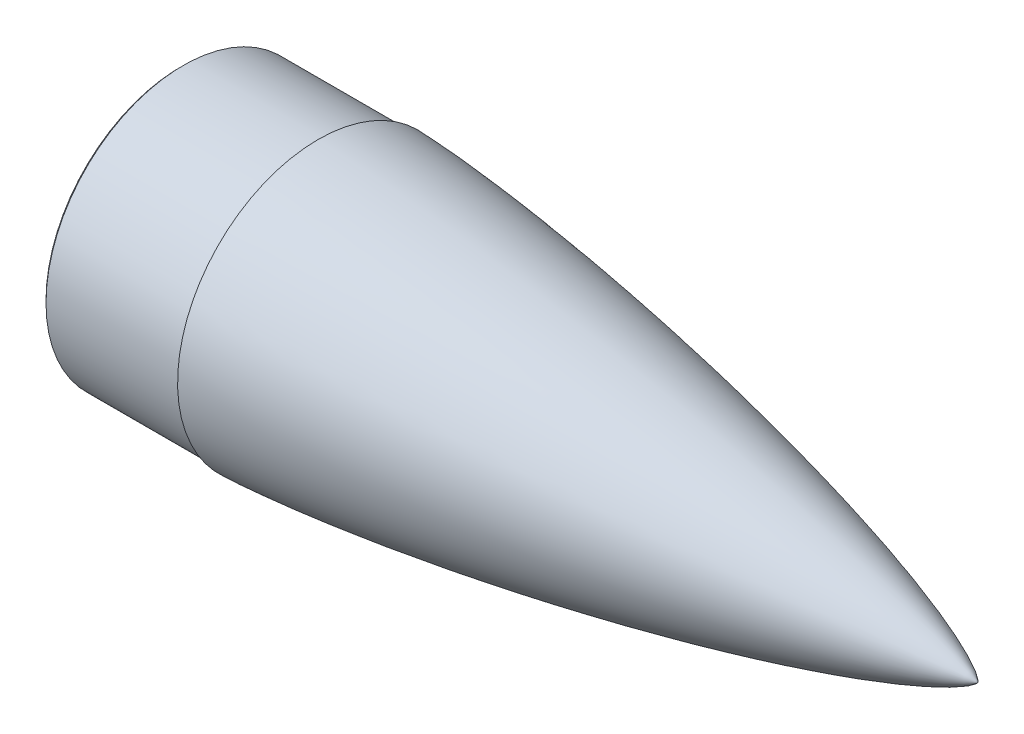
ISO-10303-21;
HEADER;
FILE_DESCRIPTION(('STEP AP214'),'2;1');
FILE_NAME('part.step','',(''),(''),'','','');
FILE_SCHEMA(('AUTOMOTIVE_DESIGN { 1 0 10303 214 1 1 1 1 }'));
ENDSEC;
DATA;
#1=APPLICATION_CONTEXT('core data for automotive mechanical design processes');
#2=APPLICATION_PROTOCOL_DEFINITION('international standard','automotive_design',2000,#1);
#3=PRODUCT_CONTEXT('',#1,'mechanical');
#4=PRODUCT('Part','Part','',(#3));
#5=PRODUCT_RELATED_PRODUCT_CATEGORY('part','',(#4));
#6=PRODUCT_DEFINITION_FORMATION('','',#4);
#7=PRODUCT_DEFINITION_CONTEXT('part definition',#1,'design');
#8=PRODUCT_DEFINITION('design','',#6,#7);
#9=PRODUCT_DEFINITION_SHAPE('','',#8);
#10=(LENGTH_UNIT() NAMED_UNIT(*) SI_UNIT(.MILLI.,.METRE.));
#11=(NAMED_UNIT(*) PLANE_ANGLE_UNIT() SI_UNIT($,.RADIAN.));
#12=(NAMED_UNIT(*) SI_UNIT($,.STERADIAN.) SOLID_ANGLE_UNIT());
#13=UNCERTAINTY_MEASURE_WITH_UNIT(LENGTH_MEASURE(1.E-05),#10,'distance_accuracy_value','');
#14=(GEOMETRIC_REPRESENTATION_CONTEXT(3) GLOBAL_UNCERTAINTY_ASSIGNED_CONTEXT((#13)) GLOBAL_UNIT_ASSIGNED_CONTEXT((#10,
#11,#12)) REPRESENTATION_CONTEXT('',''));
#15=CARTESIAN_POINT('',(0.,0.,0.));
#16=DIRECTION('',(0.,0.,1.));
#17=DIRECTION('',(1.,0.,0.));
#18=AXIS2_PLACEMENT_3D('',#15,#16,#17);
#19=CARTESIAN_POINT('',(-84.6045174731784,81.99983,0.));
#20=DIRECTION('',(-1.,0.,0.));
#21=DIRECTION('',(0.,0.,1.));
#22=AXIS2_PLACEMENT_3D('',#19,#20,#21);
#23=PLANE('',#22);
#24=CARTESIAN_POINT('',(-84.6045174731784,0.,0.));
#25=DIRECTION('',(-1.,0.,0.));
#26=DIRECTION('',(0.,0.,1.));
#27=AXIS2_PLACEMENT_3D('',#24,#25,#26);
#28=CIRCLE('',#27,83.49983);
#29=CARTESIAN_POINT('',(-84.6045174731784,0.,83.49983));
#30=VERTEX_POINT('',#29);
#31=EDGE_CURVE('E11',#30,#30,#28,.T.);
#32=ORIENTED_EDGE('',*,*,#31,.T.);
#33=EDGE_LOOP('',(#32));
#34=FACE_BOUND('',#33,.T.);
#35=CARTESIAN_POINT('',(-84.6045174731784,0.,0.));
#36=DIRECTION('',(1.,0.,0.));
#37=DIRECTION('',(0.,0.,-1.));
#38=AXIS2_PLACEMENT_3D('',#35,#36,#37);
#39=CIRCLE('',#38,81.99983);
#40=CARTESIAN_POINT('',(-84.6045174731784,0.,-81.99983));
#41=VERTEX_POINT('',#40);
#42=EDGE_CURVE('E115',#41,#41,#39,.T.);
#43=ORIENTED_EDGE('',*,*,#42,.T.);
#44=EDGE_LOOP('',(#43));
#45=FACE_BOUND('',#44,.T.);
#46=ADVANCED_FACE('F37',(#34,#45),#23,.T.);
#47=CARTESIAN_POINT('',(46.9178584693199,0.,0.));
#48=DIRECTION('',(1.,0.,0.));
#49=DIRECTION('',(0.,0.,-1.));
#50=AXIS2_PLACEMENT_3D('',#47,#48,#49);
#51=CYLINDRICAL_SURFACE('',#50,84.99983);
#52=CARTESIAN_POINT('',(-83.1045174731784,0.,0.));
#53=DIRECTION('',(-1.,0.,0.));
#54=DIRECTION('',(0.,0.,1.));
#55=AXIS2_PLACEMENT_3D('',#52,#53,#54);
#56=CIRCLE('',#55,84.99983);
#57=CARTESIAN_POINT('',(-83.1045174731784,0.,84.99983));
#58=VERTEX_POINT('',#57);
#59=EDGE_CURVE('E45',#58,#58,#56,.F.);
#60=ORIENTED_EDGE('',*,*,#59,.T.);
#61=EDGE_LOOP('',(#60));
#62=FACE_BOUND('',#61,.T.);
#63=CARTESIAN_POINT('',(0.395312526821567,0.,0.));
#64=DIRECTION('',(1.,0.,0.));
#65=DIRECTION('',(0.,0.,-1.));
#66=AXIS2_PLACEMENT_3D('',#63,#64,#65);
#67=CIRCLE('',#66,84.99983);
#68=CARTESIAN_POINT('',(0.395312526821567,0.,-84.99983));
#69=VERTEX_POINT('',#68);
#70=EDGE_CURVE('E167',#69,#69,#67,.T.);
#71=ORIENTED_EDGE('',*,*,#70,.F.);
#72=EDGE_LOOP('',(#71));
#73=FACE_BOUND('',#72,.T.);
#74=ADVANCED_FACE('F141',(#62,#73),#51,.T.);
#75=CARTESIAN_POINT('',(0.395312526821506,84.99983,0.));
#76=DIRECTION('',(-1.,0.,0.));
#77=DIRECTION('',(0.,0.,1.));
#78=AXIS2_PLACEMENT_3D('',#75,#76,#77);
#79=PLANE('',#78);
#80=ORIENTED_EDGE('',*,*,#70,.T.);
#81=EDGE_LOOP('',(#80));
#82=FACE_BOUND('',#81,.T.);
#83=CARTESIAN_POINT('',(0.395312526821442,0.,0.));
#84=DIRECTION('',(1.,0.,0.));
#85=DIRECTION('',(0.,0.,-1.));
#86=AXIS2_PLACEMENT_3D('',#83,#84,#85);
#87=CIRCLE('',#86,86.99983);
#88=CARTESIAN_POINT('',(0.395312526821442,0.,-86.99983));
#89=VERTEX_POINT('',#88);
#90=EDGE_CURVE('E164',#89,#89,#87,.T.);
#91=ORIENTED_EDGE('',*,*,#90,.F.);
#92=EDGE_LOOP('',(#91));
#93=FACE_BOUND('',#92,.T.);
#94=ADVANCED_FACE('F137',(#82,#93),#79,.T.);
#95=CARTESIAN_POINT('',(408.967251822671,0.,0.));
#96=CARTESIAN_POINT('',(408.964913524309,0.0135017388946303,0.));
#97=CARTESIAN_POINT('',(408.958040757842,0.0399160773368835,0.));
#98=CARTESIAN_POINT('',(408.936520440702,0.0904856976591331,0.));
#99=CARTESIAN_POINT('',(408.89222207581,0.174057132181965,0.));
#100=CARTESIAN_POINT('',(408.826281575483,0.275556802982871,0.));
#101=CARTESIAN_POINT('',(408.721696416073,0.415833756400021,0.));
#102=CARTESIAN_POINT('',(408.561101809182,0.605075244665577,0.));
#103=CARTESIAN_POINT('',(408.305619180198,0.872424149776899,0.));
#104=CARTESIAN_POINT('',(407.869667129884,1.27529956193635,0.));
#105=CARTESIAN_POINT('',(407.120955137874,1.88514211511049,0.));
#106=CARTESIAN_POINT('',(405.803773451327,2.8259018501857,0.));
#107=CARTESIAN_POINT('',(403.462406920435,4.28715279437305,0.));
#108=CARTESIAN_POINT('',(399.325294487522,6.53181845443187,0.));
#109=CARTESIAN_POINT('',(392.481146887534,9.75890464929676,0.));
#110=CARTESIAN_POINT('',(380.662076725118,14.628008466058,0.));
#111=CARTESIAN_POINT('',(363.637187185103,20.7117203818523,0.));
#112=CARTESIAN_POINT('',(342.215241093199,27.476512988503,0.));
#113=CARTESIAN_POINT('',(317.428462321169,34.4976264699902,0.));
#114=CARTESIAN_POINT('',(291.879335737445,41.1048243902447,0.));
#115=CARTESIAN_POINT('',(266.210460920412,47.2289931688774,0.));
#116=CARTESIAN_POINT('',(240.445488359744,52.9334367772789,0.));
#117=CARTESIAN_POINT('',(214.598861982297,58.2554390089734,0.));
#118=CARTESIAN_POINT('',(188.680895660279,63.2175826932426,0.));
#119=CARTESIAN_POINT('',(165.946174917208,67.2532806785126,0.));
#120=CARTESIAN_POINT('',(146.421982586261,70.4937997215436,0.));
#121=CARTESIAN_POINT('',(130.127893898103,73.0449474678022,0.));
#122=CARTESIAN_POINT('',(117.078590637244,74.994157933287,0.));
#123=CARTESIAN_POINT('',(104.015464216165,76.8485407904921,0.));
#124=CARTESIAN_POINT('',(92.5732639587286,78.3844920450082,0.));
#125=CARTESIAN_POINT('',(82.757139440995,79.6356039727628,0.));
#126=CARTESIAN_POINT('',(74.5713401839697,80.6322199022326,0.));
#127=CARTESIAN_POINT('',(68.0192604541921,81.4008042107162,0.));
#128=CARTESIAN_POINT('',(61.4637233644967,82.1393758993439,0.));
#129=CARTESIAN_POINT('',(54.904698020018,82.8463772595978,0.));
#130=CARTESIAN_POINT('',(48.3421599181037,83.5199405058238,0.));
#131=CARTESIAN_POINT('',(41.7760575593893,84.1577871701676,0.));
#132=CARTESIAN_POINT('',(36.0275410798151,84.6821572388814,0.));
#133=CARTESIAN_POINT('',(31.097921258978,85.1052349120102,0.));
#134=CARTESIAN_POINT('',(26.9883179227046,85.4386698248277,0.));
#135=CARTESIAN_POINT('',(23.6996666177478,85.6932185939728,0.));
#136=CARTESIAN_POINT('',(20.0858078220367,85.9584480380997,0.));
#137=CARTESIAN_POINT('',(16.7198738206758,86.1890184851633,0.));
#138=CARTESIAN_POINT('',(13.6020982871385,86.3869667789933,0.));
#139=CARTESIAN_POINT('',(10.7327040130569,86.5545757438157,0.));
#140=CARTESIAN_POINT('',(8.43663500836282,86.6787032911545,0.));
#141=CARTESIAN_POINT('',(6.13999734052088,86.7921575854767,0.));
#142=CARTESIAN_POINT('',(4.12989206270139,86.8793132637732,0.));
#143=CARTESIAN_POINT('',(2.40653858007264,86.9446189815575,0.));
#144=CARTESIAN_POINT('',(1.25734863548316,86.9790224955032,0.));
#145=CARTESIAN_POINT('',(0.682697909866076,86.9949146203242,0.));
#146=CARTESIAN_POINT('',(0.395312526821445,86.99983,0.));
#147=B_SPLINE_CURVE_WITH_KNOTS('',4,(#95,#96,#97,#98,#99,#100,#101,#102,#103,#104,#105,#106,
#107,#108,#109,#110,#111,#112,#113,#114,#115,#116,#117,#118,#119,#120,#121,#122,#123,#124,#125,
#126,#127,#128,#129,#130,#131,#132,#133,#134,#135,#136,#137,#138,#139,#140,#141,#142,#143,#144,
#145,#146),.UNSPECIFIED.,.F.,.F.,(5,1,1,1,1,1,1,1,1,1,1,1,1,1,1,1,1,1,1,1,1,1,1,1,1,1,1,1,1,1,1,
1,1,1,1,1,1,1,1,1,1,1,1,1,1,1,1,1,5),(0.,0.000130122730793774,0.000260245461587547,
0.000520490923175095,0.000900390598891898,0.0012802902746087,0.00192509879202123,
0.00288150817718921,0.00441820752915464,0.00692708577491599,0.0111106973974526,
0.0182791377136376,0.0306727604209067,0.051704468996729,0.0831022801208259,0.139908797407073,
0.202702512646724,0.26549616528218,0.328289681584927,0.391083359416936,0.453876973450593,
0.516670577319054,0.579464196659418,0.642257765268514,0.673654596336679,0.705051427404843,
0.736448266643587,0.76784510588233,0.799241873583516,0.814940257434108,0.830638641284701,
0.846337072983396,0.862035504682092,0.877733936380787,0.893432368079482,0.909130719940439,
0.924829071801395,0.932678247731873,0.940527423662352,0.94837659959283,0.956225775523308,
0.967169331642481,0.972641109702068,0.978112887761654,0.983584665821241,0.989056443880827,
0.994528221940413,0.997264110970207,1.),.UNSPECIFIED.);
#148=CARTESIAN_POINT('',(46.9178584693199,0.,0.));
#149=DIRECTION('',(1.,0.,0.));
#150=AXIS1_PLACEMENT('',#148,#149);
#151=SURFACE_OF_REVOLUTION('',#147,#150);
#152=ORIENTED_EDGE('',*,*,#90,.T.);
#153=EDGE_LOOP('',(#152));
#154=FACE_BOUND('',#153,.T.);
#155=CARTESIAN_POINT('',(408.967251822671,0.,0.));
#156=VERTEX_POINT('',#155);
#157=VERTEX_LOOP('',#156);
#158=FACE_BOUND('',#157,.T.);
#159=ADVANCED_FACE('F133',(#154,#158),#151,.F.);
#160=CARTESIAN_POINT('',(129.304508698266,67.4998299999996,0.));
#161=CARTESIAN_POINT('',(129.56275730243,67.455859882909,0.));
#162=CARTESIAN_POINT('',(132.67942523591,66.9245174442811,0.));
#163=CARTESIAN_POINT('',(141.50905193103,65.39562826931,0.));
#164=CARTESIAN_POINT('',(156.03456787351,62.7717153652316,0.));
#165=CARTESIAN_POINT('',(175.966897581105,58.9342556437838,0.));
#166=CARTESIAN_POINT('',(198.683967628958,54.2345009270161,0.));
#167=CARTESIAN_POINT('',(221.331994001222,49.212017940881,0.));
#168=CARTESIAN_POINT('',(243.90137912285,43.8468951855248,0.));
#169=CARTESIAN_POINT('',(266.378532844804,38.106125474283,0.));
#170=CARTESIAN_POINT('',(288.741266406197,31.9336935083646,0.));
#171=CARTESIAN_POINT('',(310.425167901858,25.3985692586692,0.));
#172=CARTESIAN_POINT('',(329.152005397616,19.1284839647496,0.));
#173=CARTESIAN_POINT('',(344.042994900832,13.5076950112197,0.));
#174=CARTESIAN_POINT('',(354.402196649447,9.01831006956192,0.));
#175=CARTESIAN_POINT('',(360.425978756185,6.04073439622553,0.));
#176=CARTESIAN_POINT('',(364.092823889542,3.96003232781514,0.));
#177=CARTESIAN_POINT('',(366.176060795862,2.60155915402352,0.));
#178=CARTESIAN_POINT('',(367.344738263332,1.72985368517451,0.));
#179=CARTESIAN_POINT('',(368.008659120661,1.1649049648713,0.));
#180=CARTESIAN_POINT('',(368.392888737311,0.793577299361299,0.));
#181=CARTESIAN_POINT('',(368.616653261937,0.548352839719824,0.));
#182=CARTESIAN_POINT('',(368.75569012407,0.376555746293117,0.));
#183=CARTESIAN_POINT('',(368.845538096967,0.250270687361392,0.));
#184=CARTESIAN_POINT('',(368.902304551544,0.158736421423559,0.));
#185=CARTESIAN_POINT('',(368.940636146556,0.0829640066765009,0.));
#186=CARTESIAN_POINT('',(368.959416882334,0.0365183779116873,0.));
#187=CARTESIAN_POINT('',(368.965299542606,0.0123384894312348,0.));
#188=CARTESIAN_POINT('',(368.967251822671,0.,0.));
#189=B_SPLINE_CURVE_WITH_KNOTS('',4,(#160,#161,#162,#163,#164,#165,#166,#167,#168,#169,#170,
#171,#172,#173,#174,#175,#176,#177,#178,#179,#180,#181,#182,#183,#184,#185,#186,#187,#188),
.UNSPECIFIED.,.F.,.F.,(5,1,1,1,1,1,1,1,1,1,1,1,1,1,1,1,1,1,1,1,1,1,1,1,1,5),(0.,
0.00283647920485153,0.034233244450974,0.0970268810088304,0.159820508547677,0.222614108737857,
0.285407697383066,0.348201256139446,0.410995008794823,0.473788580676128,0.536581936684739,
0.593389064111305,0.62478659308442,0.646068205580614,0.658784205851289,0.666111808975224,
0.67041076023301,0.672980202977588,0.674560712872232,0.675544641713971,0.676192795140024,
0.676572535039859,0.676952274939695,0.677222173692942,0.677357123069566,0.677492072446189),.UNSPECIFIED.);
#190=CARTESIAN_POINT('',(46.9178584693199,0.,0.));
#191=DIRECTION('',(1.,0.,0.));
#192=AXIS1_PLACEMENT('',#190,#191);
#193=SURFACE_OF_REVOLUTION('',#189,#192);
#194=CARTESIAN_POINT('',(368.967251822671,0.,0.));
#195=VERTEX_POINT('',#194);
#196=VERTEX_LOOP('',#195);
#197=FACE_BOUND('',#196,.T.);
#198=CARTESIAN_POINT('',(129.304508698264,0.,0.));
#199=DIRECTION('',(1.,0.,0.));
#200=DIRECTION('',(0.,0.,-1.));
#201=AXIS2_PLACEMENT_3D('',#198,#199,#200);
#202=CIRCLE('',#201,67.49983);
#203=CARTESIAN_POINT('',(129.304508698264,0.,-67.49983));
#204=VERTEX_POINT('',#203);
#205=EDGE_CURVE('E161',#204,#204,#202,.T.);
#206=ORIENTED_EDGE('',*,*,#205,.F.);
#207=EDGE_LOOP('',(#206));
#208=FACE_BOUND('',#207,.T.);
#209=ADVANCED_FACE('F128',(#197,#208),#193,.F.);
#210=CARTESIAN_POINT('',(46.9178584693199,0.,0.));
#211=DIRECTION('',(1.,0.,0.));
#212=DIRECTION('',(0.,0.,-1.));
#213=AXIS2_PLACEMENT_3D('',#210,#211,#212);
#214=CYLINDRICAL_SURFACE('',#213,67.49983);
#215=ORIENTED_EDGE('',*,*,#205,.T.);
#216=EDGE_LOOP('',(#215));
#217=FACE_BOUND('',#216,.T.);
#218=CARTESIAN_POINT('',(11.1124937434032,0.,0.));
#219=DIRECTION('',(1.,0.,0.));
#220=DIRECTION('',(0.,0.,-1.));
#221=AXIS2_PLACEMENT_3D('',#218,#219,#220);
#222=CIRCLE('',#221,67.49983);
#223=CARTESIAN_POINT('',(11.1124937434032,0.,-67.49983));
#224=VERTEX_POINT('',#223);
#225=EDGE_CURVE('E156',#224,#224,#222,.T.);
#226=ORIENTED_EDGE('',*,*,#225,.F.);
#227=EDGE_LOOP('',(#226));
#228=FACE_BOUND('',#227,.T.);
#229=ADVANCED_FACE('F132',(#217,#228),#214,.F.);
#230=CARTESIAN_POINT('',(11.1124937434032,81.99983,0.));
#231=DIRECTION('',(-1.,0.,0.));
#232=DIRECTION('',(0.,0.,1.));
#233=AXIS2_PLACEMENT_3D('',#230,#231,#232);
#234=PLANE('',#233);
#235=CARTESIAN_POINT('',(11.1124937434032,1.04777297948999E-12,-74.74983));
#236=DIRECTION('',(-1.,0.,0.));
#237=DIRECTION('',(0.,0.,1.));
#238=AXIS2_PLACEMENT_3D('',#235,#236,#237);
#239=CIRCLE('',#238,2.1);
#240=CARTESIAN_POINT('',(11.1124937434032,1.04777297948999E-12,-72.64983));
#241=VERTEX_POINT('',#240);
#242=EDGE_CURVE('E81',#241,#241,#239,.T.);
#243=ORIENTED_EDGE('',*,*,#242,.F.);
#244=EDGE_LOOP('',(#243));
#245=FACE_BOUND('',#244,.T.);
#246=CARTESIAN_POINT('',(11.1124937434032,-64.7352517085677,-37.3749150000007));
#247=DIRECTION('',(-1.,0.,0.));
#248=DIRECTION('',(0.,0.,1.));
#249=AXIS2_PLACEMENT_3D('',#246,#247,#248);
#250=CIRCLE('',#249,2.09999999999999);
#251=CARTESIAN_POINT('',(11.1124937434032,-64.7352517085677,-35.2749150000008));
#252=VERTEX_POINT('',#251);
#253=EDGE_CURVE('E80',#252,#252,#250,.T.);
#254=ORIENTED_EDGE('',*,*,#253,.F.);
#255=EDGE_LOOP('',(#254));
#256=FACE_BOUND('',#255,.T.);
#257=CARTESIAN_POINT('',(11.1124937434032,-64.7352517085682,37.3749149999998));
#258=DIRECTION('',(-1.,0.,0.));
#259=DIRECTION('',(0.,0.,1.));
#260=AXIS2_PLACEMENT_3D('',#257,#258,#259);
#261=CIRCLE('',#260,2.09999999999999);
#262=CARTESIAN_POINT('',(11.1124937434032,-64.7352517085682,39.4749149999998));
#263=VERTEX_POINT('',#262);
#264=EDGE_CURVE('E91',#263,#263,#261,.T.);
#265=ORIENTED_EDGE('',*,*,#264,.F.);
#266=EDGE_LOOP('',(#265));
#267=FACE_BOUND('',#266,.T.);
#268=CARTESIAN_POINT('',(11.1124937434032,-5.20417042793042E-13,74.74983));
#269=DIRECTION('',(-1.,0.,0.));
#270=DIRECTION('',(0.,0.,1.));
#271=AXIS2_PLACEMENT_3D('',#268,#269,#270);
#272=CIRCLE('',#271,2.1);
#273=CARTESIAN_POINT('',(11.1124937434032,-5.20417042793042E-13,76.84983));
#274=VERTEX_POINT('',#273);
#275=EDGE_CURVE('E97',#274,#274,#272,.T.);
#276=ORIENTED_EDGE('',*,*,#275,.F.);
#277=EDGE_LOOP('',(#276));
#278=FACE_BOUND('',#277,.T.);
#279=CARTESIAN_POINT('',(11.1124937434032,64.735251708568,37.3749150000003));
#280=DIRECTION('',(-1.,0.,0.));
#281=DIRECTION('',(0.,0.,1.));
#282=AXIS2_PLACEMENT_3D('',#279,#280,#281);
#283=CIRCLE('',#282,2.09999999999999);
#284=CARTESIAN_POINT('',(11.1124937434032,64.735251708568,39.4749150000003));
#285=VERTEX_POINT('',#284);
#286=EDGE_CURVE('E103',#285,#285,#283,.T.);
#287=ORIENTED_EDGE('',*,*,#286,.F.);
#288=EDGE_LOOP('',(#287));
#289=FACE_BOUND('',#288,.T.);
#290=CARTESIAN_POINT('',(11.1124937434032,64.7352517085682,-37.3749149999998));
#291=DIRECTION('',(-1.,0.,0.));
#292=DIRECTION('',(0.,0.,1.));
#293=AXIS2_PLACEMENT_3D('',#290,#291,#292);
#294=CIRCLE('',#293,2.09999999999999);
#295=CARTESIAN_POINT('',(11.1124937434032,64.7352517085682,-35.2749149999999));
#296=VERTEX_POINT('',#295);
#297=EDGE_CURVE('E109',#296,#296,#294,.T.);
#298=ORIENTED_EDGE('',*,*,#297,.F.);
#299=EDGE_LOOP('',(#298));
#300=FACE_BOUND('',#299,.T.);
#301=ORIENTED_EDGE('',*,*,#225,.T.);
#302=EDGE_LOOP('',(#301));
#303=FACE_BOUND('',#302,.T.);
#304=CARTESIAN_POINT('',(11.1124937434031,0.,0.));
#305=DIRECTION('',(1.,0.,0.));
#306=DIRECTION('',(0.,0.,-1.));
#307=AXIS2_PLACEMENT_3D('',#304,#305,#306);
#308=CIRCLE('',#307,81.99983);
#309=CARTESIAN_POINT('',(11.1124937434031,0.,-81.99983));
#310=VERTEX_POINT('',#309);
#311=EDGE_CURVE('E154',#310,#310,#308,.T.);
#312=ORIENTED_EDGE('',*,*,#311,.F.);
#313=EDGE_LOOP('',(#312));
#314=FACE_BOUND('',#313,.T.);
#315=ADVANCED_FACE('F184',(#245,#256,#267,#278,#289,#300,#303,#314),#234,.T.);
#316=CARTESIAN_POINT('',(46.9178584693199,0.,0.));
#317=DIRECTION('',(1.,0.,0.));
#318=DIRECTION('',(0.,0.,-1.));
#319=AXIS2_PLACEMENT_3D('',#316,#317,#318);
#320=CYLINDRICAL_SURFACE('',#319,81.99983);
#321=ORIENTED_EDGE('',*,*,#311,.T.);
#322=EDGE_LOOP('',(#321));
#323=FACE_BOUND('',#322,.T.);
#324=ORIENTED_EDGE('',*,*,#42,.F.);
#325=EDGE_LOOP('',(#324));
#326=FACE_BOUND('',#325,.T.);
#327=ADVANCED_FACE('F175',(#323,#326),#320,.F.);
#328=CARTESIAN_POINT('',(-83.1045174731784,0.,0.));
#329=DIRECTION('',(1.,0.,0.));
#330=DIRECTION('',(0.,0.,-1.));
#331=AXIS2_PLACEMENT_3D('',#328,#329,#330);
#332=CONICAL_SURFACE('',#331,84.99983,0.785398163397467);
#333=ORIENTED_EDGE('',*,*,#31,.F.);
#334=EDGE_LOOP('',(#333));
#335=FACE_BOUND('',#334,.T.);
#336=ORIENTED_EDGE('',*,*,#59,.F.);
#337=EDGE_LOOP('',(#336));
#338=FACE_BOUND('',#337,.T.);
#339=ADVANCED_FACE('F39',(#335,#338),#332,.T.);
#340=CARTESIAN_POINT('',(41.1124937434032,64.7352517085682,-37.3749149999998));
#341=DIRECTION('',(-1.,0.,0.));
#342=DIRECTION('',(0.,0.,1.));
#343=AXIS2_PLACEMENT_3D('',#340,#341,#342);
#344=CONICAL_SURFACE('',#343,2.09999999999999,1.02974425867665);
#345=CARTESIAN_POINT('',(42.374301043361,64.7352517085682,-37.3749149999998));
#346=VERTEX_POINT('',#345);
#347=VERTEX_LOOP('',#346);
#348=FACE_BOUND('',#347,.T.);
#349=CARTESIAN_POINT('',(41.1124937434032,64.7352517085682,-37.3749149999998));
#350=DIRECTION('',(-1.,0.,0.));
#351=DIRECTION('',(0.,0.,1.));
#352=AXIS2_PLACEMENT_3D('',#349,#350,#351);
#353=CIRCLE('',#352,2.09999999999999);
#354=CARTESIAN_POINT('',(41.1124937434032,64.7352517085682,-35.2749149999999));
#355=VERTEX_POINT('',#354);
#356=EDGE_CURVE('E112',#355,#355,#353,.T.);
#357=ORIENTED_EDGE('',*,*,#356,.T.);
#358=EDGE_LOOP('',(#357));
#359=FACE_BOUND('',#358,.T.);
#360=ADVANCED_FACE('F174',(#348,#359),#344,.F.);
#361=CARTESIAN_POINT('',(11.1124937434032,64.7352517085682,-37.3749149999998));
#362=DIRECTION('',(-1.,0.,0.));
#363=DIRECTION('',(0.,0.,1.));
#364=AXIS2_PLACEMENT_3D('',#361,#362,#363);
#365=CYLINDRICAL_SURFACE('',#364,2.09999999999999);
#366=ORIENTED_EDGE('',*,*,#356,.F.);
#367=EDGE_LOOP('',(#366));
#368=FACE_BOUND('',#367,.T.);
#369=ORIENTED_EDGE('',*,*,#297,.T.);
#370=EDGE_LOOP('',(#369));
#371=FACE_BOUND('',#370,.T.);
#372=ADVANCED_FACE('F181',(#368,#371),#365,.F.);
#373=CARTESIAN_POINT('',(41.1124937434032,64.735251708568,37.3749150000003));
#374=DIRECTION('',(-1.,0.,0.));
#375=DIRECTION('',(0.,0.,1.));
#376=AXIS2_PLACEMENT_3D('',#373,#374,#375);
#377=CONICAL_SURFACE('',#376,2.09999999999999,1.02974425867665);
#378=CARTESIAN_POINT('',(42.374301043361,64.7352517085679,37.3749150000003));
#379=VERTEX_POINT('',#378);
#380=VERTEX_LOOP('',#379);
#381=FACE_BOUND('',#380,.T.);
#382=CARTESIAN_POINT('',(41.1124937434032,64.735251708568,37.3749150000003));
#383=DIRECTION('',(-1.,0.,0.));
#384=DIRECTION('',(0.,0.,1.));
#385=AXIS2_PLACEMENT_3D('',#382,#383,#384);
#386=CIRCLE('',#385,2.09999999999999);
#387=CARTESIAN_POINT('',(41.1124937434032,64.735251708568,39.4749150000003));
#388=VERTEX_POINT('',#387);
#389=EDGE_CURVE('E106',#388,#388,#386,.T.);
#390=ORIENTED_EDGE('',*,*,#389,.T.);
#391=EDGE_LOOP('',(#390));
#392=FACE_BOUND('',#391,.T.);
#393=ADVANCED_FACE('F194',(#381,#392),#377,.F.);
#394=CARTESIAN_POINT('',(11.1124937434032,64.735251708568,37.3749150000003));
#395=DIRECTION('',(-1.,0.,0.));
#396=DIRECTION('',(0.,0.,1.));
#397=AXIS2_PLACEMENT_3D('',#394,#395,#396);
#398=CYLINDRICAL_SURFACE('',#397,2.09999999999999);
#399=ORIENTED_EDGE('',*,*,#389,.F.);
#400=EDGE_LOOP('',(#399));
#401=FACE_BOUND('',#400,.T.);
#402=ORIENTED_EDGE('',*,*,#286,.T.);
#403=EDGE_LOOP('',(#402));
#404=FACE_BOUND('',#403,.T.);
#405=ADVANCED_FACE('F198',(#401,#404),#398,.F.);
#406=CARTESIAN_POINT('',(41.1124937434032,-5.20417042793042E-13,74.74983));
#407=DIRECTION('',(-1.,0.,0.));
#408=DIRECTION('',(0.,0.,1.));
#409=AXIS2_PLACEMENT_3D('',#406,#407,#408);
#410=CONICAL_SURFACE('',#409,2.09999999999999,1.02974425867665);
#411=CARTESIAN_POINT('',(42.374301043361,-5.28139916092137E-13,74.74983));
#412=VERTEX_POINT('',#411);
#413=VERTEX_LOOP('',#412);
#414=FACE_BOUND('',#413,.T.);
#415=CARTESIAN_POINT('',(41.1124937434032,-5.20417042793042E-13,74.74983));
#416=DIRECTION('',(-1.,0.,0.));
#417=DIRECTION('',(0.,0.,1.));
#418=AXIS2_PLACEMENT_3D('',#415,#416,#417);
#419=CIRCLE('',#418,2.09999999999999);
#420=CARTESIAN_POINT('',(41.1124937434032,-5.20417042793042E-13,76.84983));
#421=VERTEX_POINT('',#420);
#422=EDGE_CURVE('E100',#421,#421,#419,.T.);
#423=ORIENTED_EDGE('',*,*,#422,.T.);
#424=EDGE_LOOP('',(#423));
#425=FACE_BOUND('',#424,.T.);
#426=ADVANCED_FACE('F202',(#414,#425),#410,.F.);
#427=CARTESIAN_POINT('',(11.1124937434032,-5.20417042793042E-13,74.74983));
#428=DIRECTION('',(-1.,0.,0.));
#429=DIRECTION('',(0.,0.,1.));
#430=AXIS2_PLACEMENT_3D('',#427,#428,#429);
#431=CYLINDRICAL_SURFACE('',#430,2.1);
#432=ORIENTED_EDGE('',*,*,#422,.F.);
#433=EDGE_LOOP('',(#432));
#434=FACE_BOUND('',#433,.T.);
#435=ORIENTED_EDGE('',*,*,#275,.T.);
#436=EDGE_LOOP('',(#435));
#437=FACE_BOUND('',#436,.T.);
#438=ADVANCED_FACE('F206',(#434,#437),#431,.F.);
#439=CARTESIAN_POINT('',(41.1124937434032,-64.7352517085682,37.3749149999998));
#440=DIRECTION('',(-1.,0.,0.));
#441=DIRECTION('',(0.,0.,1.));
#442=AXIS2_PLACEMENT_3D('',#439,#440,#441);
#443=CONICAL_SURFACE('',#442,2.09999999999999,1.02974425867665);
#444=CARTESIAN_POINT('',(42.374301043361,-64.7352517085682,37.3749149999998));
#445=VERTEX_POINT('',#444);
#446=VERTEX_LOOP('',#445);
#447=FACE_BOUND('',#446,.T.);
#448=CARTESIAN_POINT('',(41.1124937434032,-64.7352517085682,37.3749149999998));
#449=DIRECTION('',(-1.,0.,0.));
#450=DIRECTION('',(0.,0.,1.));
#451=AXIS2_PLACEMENT_3D('',#448,#449,#450);
#452=CIRCLE('',#451,2.09999999999999);
#453=CARTESIAN_POINT('',(41.1124937434032,-64.7352517085682,39.4749149999998));
#454=VERTEX_POINT('',#453);
#455=EDGE_CURVE('E94',#454,#454,#452,.T.);
#456=ORIENTED_EDGE('',*,*,#455,.T.);
#457=EDGE_LOOP('',(#456));
#458=FACE_BOUND('',#457,.T.);
#459=ADVANCED_FACE('F210',(#447,#458),#443,.F.);
#460=CARTESIAN_POINT('',(11.1124937434032,-64.7352517085682,37.3749149999998));
#461=DIRECTION('',(-1.,0.,0.));
#462=DIRECTION('',(0.,0.,1.));
#463=AXIS2_PLACEMENT_3D('',#460,#461,#462);
#464=CYLINDRICAL_SURFACE('',#463,2.09999999999999);
#465=ORIENTED_EDGE('',*,*,#455,.F.);
#466=EDGE_LOOP('',(#465));
#467=FACE_BOUND('',#466,.T.);
#468=ORIENTED_EDGE('',*,*,#264,.T.);
#469=EDGE_LOOP('',(#468));
#470=FACE_BOUND('',#469,.T.);
#471=ADVANCED_FACE('F214',(#467,#470),#464,.F.);
#472=CARTESIAN_POINT('',(41.1124937434032,-64.7352517085677,-37.3749150000007));
#473=DIRECTION('',(-1.,0.,0.));
#474=DIRECTION('',(0.,0.,1.));
#475=AXIS2_PLACEMENT_3D('',#472,#473,#474);
#476=CONICAL_SURFACE('',#475,2.09999999999999,1.02974425867665);
#477=CARTESIAN_POINT('',(42.374301043361,-64.7352517085677,-37.3749150000007));
#478=VERTEX_POINT('',#477);
#479=VERTEX_LOOP('',#478);
#480=FACE_BOUND('',#479,.T.);
#481=CARTESIAN_POINT('',(41.1124937434032,-64.7352517085677,-37.3749150000007));
#482=DIRECTION('',(-1.,0.,0.));
#483=DIRECTION('',(0.,0.,1.));
#484=AXIS2_PLACEMENT_3D('',#481,#482,#483);
#485=CIRCLE('',#484,2.09999999999999);
#486=CARTESIAN_POINT('',(41.1124937434032,-64.7352517085677,-35.2749150000008));
#487=VERTEX_POINT('',#486);
#488=EDGE_CURVE('E84',#487,#487,#485,.T.);
#489=ORIENTED_EDGE('',*,*,#488,.T.);
#490=EDGE_LOOP('',(#489));
#491=FACE_BOUND('',#490,.T.);
#492=ADVANCED_FACE('F218',(#480,#491),#476,.F.);
#493=CARTESIAN_POINT('',(11.1124937434032,-64.7352517085677,-37.3749150000007));
#494=DIRECTION('',(-1.,0.,0.));
#495=DIRECTION('',(0.,0.,1.));
#496=AXIS2_PLACEMENT_3D('',#493,#494,#495);
#497=CYLINDRICAL_SURFACE('',#496,2.09999999999999);
#498=ORIENTED_EDGE('',*,*,#488,.F.);
#499=EDGE_LOOP('',(#498));
#500=FACE_BOUND('',#499,.T.);
#501=ORIENTED_EDGE('',*,*,#253,.T.);
#502=EDGE_LOOP('',(#501));
#503=FACE_BOUND('',#502,.T.);
#504=ADVANCED_FACE('F74',(#500,#503),#497,.F.);
#505=CARTESIAN_POINT('',(41.1124937434032,1.04777297948999E-12,-74.74983));
#506=DIRECTION('',(-1.,0.,0.));
#507=DIRECTION('',(0.,0.,1.));
#508=AXIS2_PLACEMENT_3D('',#505,#506,#507);
#509=CONICAL_SURFACE('',#508,2.09999999999999,1.02974425867665);
#510=CARTESIAN_POINT('',(42.374301043361,1.0400501061909E-12,-74.74983));
#511=VERTEX_POINT('',#510);
#512=VERTEX_LOOP('',#511);
#513=FACE_BOUND('',#512,.T.);
#514=CARTESIAN_POINT('',(41.1124937434032,1.04777297948999E-12,-74.74983));
#515=DIRECTION('',(-1.,0.,0.));
#516=DIRECTION('',(0.,0.,1.));
#517=AXIS2_PLACEMENT_3D('',#514,#515,#516);
#518=CIRCLE('',#517,2.09999999999999);
#519=CARTESIAN_POINT('',(41.1124937434032,1.04777297948999E-12,-72.64983));
#520=VERTEX_POINT('',#519);
#521=EDGE_CURVE('E78',#520,#520,#518,.T.);
#522=ORIENTED_EDGE('',*,*,#521,.T.);
#523=EDGE_LOOP('',(#522));
#524=FACE_BOUND('',#523,.T.);
#525=ADVANCED_FACE('F70',(#513,#524),#509,.F.);
#526=CARTESIAN_POINT('',(11.1124937434032,1.04777297948999E-12,-74.74983));
#527=DIRECTION('',(-1.,0.,0.));
#528=DIRECTION('',(0.,0.,1.));
#529=AXIS2_PLACEMENT_3D('',#526,#527,#528);
#530=CYLINDRICAL_SURFACE('',#529,2.1);
#531=ORIENTED_EDGE('',*,*,#521,.F.);
#532=EDGE_LOOP('',(#531));
#533=FACE_BOUND('',#532,.T.);
#534=ORIENTED_EDGE('',*,*,#242,.T.);
#535=EDGE_LOOP('',(#534));
#536=FACE_BOUND('',#535,.T.);
#537=ADVANCED_FACE('F73',(#533,#536),#530,.F.);
#538=CLOSED_SHELL('',(#46,#74,#94,#159,#209,#229,#315,#327,#339,#360,#372,#393,#405,#426,#438,
#459,#471,#492,#504,#525,#537));
#539=MANIFOLD_SOLID_BREP('B2',#538);
#540=ADVANCED_BREP_SHAPE_REPRESENTATION('',(#18,#539),#14);
#541=SHAPE_DEFINITION_REPRESENTATION(#9,#540);
ENDSEC;
END-ISO-10303-21;
